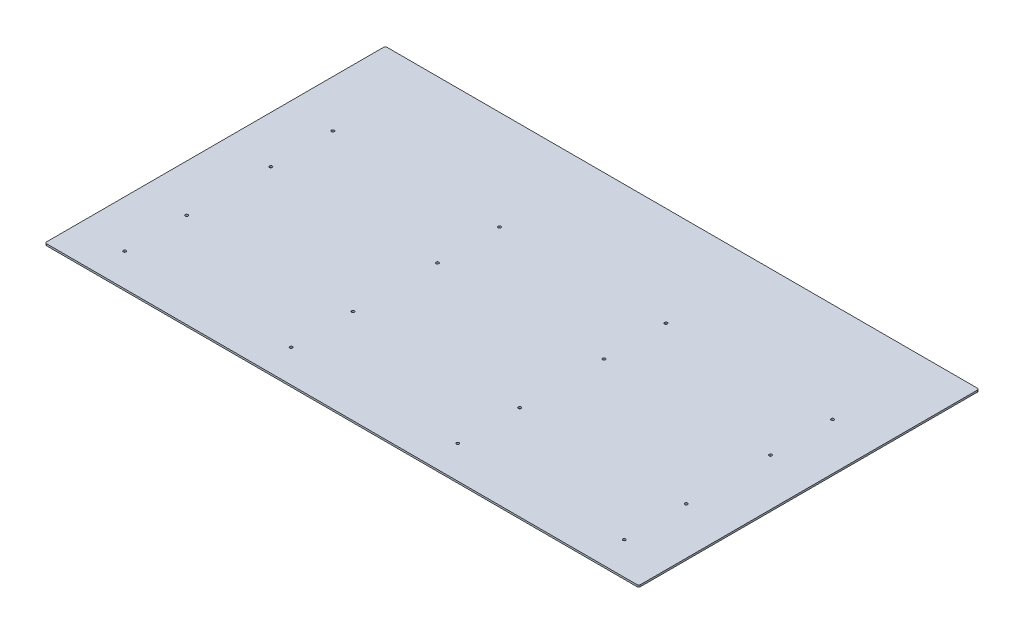
ISO-10303-21;
HEADER;
FILE_DESCRIPTION(('STEP AP214'),'2;1');
FILE_NAME('part.step','',(''),(''),'','','');
FILE_SCHEMA(('AUTOMOTIVE_DESIGN { 1 0 10303 214 1 1 1 1 }'));
ENDSEC;
DATA;
#1=APPLICATION_CONTEXT('core data for automotive mechanical design processes');
#2=APPLICATION_PROTOCOL_DEFINITION('international standard','automotive_design',2000,#1);
#3=PRODUCT_CONTEXT('',#1,'mechanical');
#4=PRODUCT('Part','Part','',(#3));
#5=PRODUCT_RELATED_PRODUCT_CATEGORY('part','',(#4));
#6=PRODUCT_DEFINITION_FORMATION('','',#4);
#7=PRODUCT_DEFINITION_CONTEXT('part definition',#1,'design');
#8=PRODUCT_DEFINITION('design','',#6,#7);
#9=PRODUCT_DEFINITION_SHAPE('','',#8);
#10=(LENGTH_UNIT() NAMED_UNIT(*) SI_UNIT(.MILLI.,.METRE.));
#11=(NAMED_UNIT(*) PLANE_ANGLE_UNIT() SI_UNIT($,.RADIAN.));
#12=(NAMED_UNIT(*) SI_UNIT($,.STERADIAN.) SOLID_ANGLE_UNIT());
#13=UNCERTAINTY_MEASURE_WITH_UNIT(LENGTH_MEASURE(1.E-05),#10,'distance_accuracy_value','');
#14=(GEOMETRIC_REPRESENTATION_CONTEXT(3) GLOBAL_UNCERTAINTY_ASSIGNED_CONTEXT((#13)) GLOBAL_UNIT_ASSIGNED_CONTEXT((#10,
#11,#12)) REPRESENTATION_CONTEXT('',''));
#15=CARTESIAN_POINT('',(0.,0.,0.));
#16=DIRECTION('',(0.,0.,1.));
#17=DIRECTION('',(1.,0.,0.));
#18=AXIS2_PLACEMENT_3D('',#15,#16,#17);
#19=CARTESIAN_POINT('',(517.525,3.175,-295.275));
#20=DIRECTION('',(0.,-1.,0.));
#21=DIRECTION('',(0.,0.,-1.));
#22=AXIS2_PLACEMENT_3D('',#19,#20,#21);
#23=CYLINDRICAL_SURFACE('',#22,3.17499999999998);
#24=CARTESIAN_POINT('',(517.525,0.,-295.275));
#25=DIRECTION('',(0.,1.,0.));
#26=DIRECTION('',(0.,0.,-1.));
#27=AXIS2_PLACEMENT_3D('',#24,#25,#26);
#28=CIRCLE('',#27,3.17499999999998);
#29=CARTESIAN_POINT('',(520.7,0.,-295.275));
#30=VERTEX_POINT('',#29);
#31=CARTESIAN_POINT('',(517.525,0.,-298.45));
#32=VERTEX_POINT('',#31);
#33=EDGE_CURVE('E133',#30,#32,#28,.T.);
#34=ORIENTED_EDGE('',*,*,#33,.T.);
#35=DIRECTION('',(0.,-1.,0.));
#36=VECTOR('',#35,1.);
#37=CARTESIAN_POINT('',(517.525,3.175,-298.45));
#38=LINE('',#37,#36);
#39=CARTESIAN_POINT('',(517.525,3.175,-298.45));
#40=VERTEX_POINT('',#39);
#41=EDGE_CURVE('E11',#40,#32,#38,.T.);
#42=ORIENTED_EDGE('',*,*,#41,.F.);
#43=CARTESIAN_POINT('',(517.525,3.175,-295.275));
#44=DIRECTION('',(0.,1.,0.));
#45=DIRECTION('',(0.,0.,-1.));
#46=AXIS2_PLACEMENT_3D('',#43,#44,#45);
#47=CIRCLE('',#46,3.17499999999998);
#48=CARTESIAN_POINT('',(520.7,3.175,-295.275));
#49=VERTEX_POINT('',#48);
#50=EDGE_CURVE('E148',#49,#40,#47,.T.);
#51=ORIENTED_EDGE('',*,*,#50,.F.);
#52=DIRECTION('',(0.,-1.,0.));
#53=VECTOR('',#52,1.);
#54=CARTESIAN_POINT('',(520.7,3.175,-295.275));
#55=LINE('',#54,#53);
#56=EDGE_CURVE('E129',#49,#30,#55,.T.);
#57=ORIENTED_EDGE('',*,*,#56,.T.);
#58=EDGE_LOOP('',(#34,#42,#51,#57));
#59=FACE_BOUND('',#58,.T.);
#60=ADVANCED_FACE('F37',(#59),#23,.T.);
#61=CARTESIAN_POINT('',(-517.525,3.175,-298.45));
#62=DIRECTION('',(0.,0.,1.));
#63=DIRECTION('',(1.,0.,0.));
#64=AXIS2_PLACEMENT_3D('',#61,#62,#63);
#65=PLANE('',#64);
#66=DIRECTION('',(-1.,0.,0.));
#67=VECTOR('',#66,1.);
#68=CARTESIAN_POINT('',(-517.525,0.,-298.45));
#69=LINE('',#68,#67);
#70=CARTESIAN_POINT('',(-517.525,0.,-298.45));
#71=VERTEX_POINT('',#70);
#72=EDGE_CURVE('E136',#32,#71,#69,.T.);
#73=ORIENTED_EDGE('',*,*,#72,.T.);
#74=DIRECTION('',(0.,-1.,0.));
#75=VECTOR('',#74,1.);
#76=CARTESIAN_POINT('',(-517.525,3.175,-298.45));
#77=LINE('',#76,#75);
#78=CARTESIAN_POINT('',(-517.525,3.175,-298.45));
#79=VERTEX_POINT('',#78);
#80=EDGE_CURVE('E45',#79,#71,#77,.T.);
#81=ORIENTED_EDGE('',*,*,#80,.F.);
#82=DIRECTION('',(-1.,0.,0.));
#83=VECTOR('',#82,1.);
#84=CARTESIAN_POINT('',(-517.525,3.175,-298.45));
#85=LINE('',#84,#83);
#86=EDGE_CURVE('E96',#40,#79,#85,.T.);
#87=ORIENTED_EDGE('',*,*,#86,.F.);
#88=ORIENTED_EDGE('',*,*,#41,.T.);
#89=EDGE_LOOP('',(#73,#81,#87,#88));
#90=FACE_BOUND('',#89,.T.);
#91=ADVANCED_FACE('F326',(#90),#65,.F.);
#92=CARTESIAN_POINT('',(-517.525,3.175,-295.275));
#93=DIRECTION('',(0.,-1.,0.));
#94=DIRECTION('',(0.,0.,-1.));
#95=AXIS2_PLACEMENT_3D('',#92,#93,#94);
#96=CYLINDRICAL_SURFACE('',#95,3.17499999999998);
#97=CARTESIAN_POINT('',(-517.525,0.,-295.275));
#98=DIRECTION('',(0.,1.,0.));
#99=DIRECTION('',(0.,0.,-1.));
#100=AXIS2_PLACEMENT_3D('',#97,#98,#99);
#101=CIRCLE('',#100,3.17499999999998);
#102=CARTESIAN_POINT('',(-520.7,0.,-295.275));
#103=VERTEX_POINT('',#102);
#104=EDGE_CURVE('E139',#71,#103,#101,.T.);
#105=ORIENTED_EDGE('',*,*,#104,.T.);
#106=DIRECTION('',(0.,-1.,0.));
#107=VECTOR('',#106,1.);
#108=CARTESIAN_POINT('',(-520.7,3.175,-295.275));
#109=LINE('',#108,#107);
#110=CARTESIAN_POINT('',(-520.7,3.175,-295.275));
#111=VERTEX_POINT('',#110);
#112=EDGE_CURVE('E155',#111,#103,#109,.T.);
#113=ORIENTED_EDGE('',*,*,#112,.F.);
#114=CARTESIAN_POINT('',(-517.525,3.175,-295.275));
#115=DIRECTION('',(0.,1.,0.));
#116=DIRECTION('',(0.,0.,-1.));
#117=AXIS2_PLACEMENT_3D('',#114,#115,#116);
#118=CIRCLE('',#117,3.17499999999998);
#119=EDGE_CURVE('E163',#79,#111,#118,.T.);
#120=ORIENTED_EDGE('',*,*,#119,.F.);
#121=ORIENTED_EDGE('',*,*,#80,.T.);
#122=EDGE_LOOP('',(#105,#113,#120,#121));
#123=FACE_BOUND('',#122,.T.);
#124=ADVANCED_FACE('F161',(#123),#96,.T.);
#125=CARTESIAN_POINT('',(-520.7,3.175,295.275));
#126=DIRECTION('',(1.,0.,0.));
#127=DIRECTION('',(0.,0.,-1.));
#128=AXIS2_PLACEMENT_3D('',#125,#126,#127);
#129=PLANE('',#128);
#130=DIRECTION('',(0.,0.,1.));
#131=VECTOR('',#130,1.);
#132=CARTESIAN_POINT('',(-520.7,0.,295.275));
#133=LINE('',#132,#131);
#134=CARTESIAN_POINT('',(-520.7,0.,295.275));
#135=VERTEX_POINT('',#134);
#136=EDGE_CURVE('E141',#103,#135,#133,.T.);
#137=ORIENTED_EDGE('',*,*,#136,.T.);
#138=DIRECTION('',(0.,-1.,0.));
#139=VECTOR('',#138,1.);
#140=CARTESIAN_POINT('',(-520.7,3.175,295.275));
#141=LINE('',#140,#139);
#142=CARTESIAN_POINT('',(-520.7,3.175,295.275));
#143=VERTEX_POINT('',#142);
#144=EDGE_CURVE('E152',#143,#135,#141,.T.);
#145=ORIENTED_EDGE('',*,*,#144,.F.);
#146=DIRECTION('',(0.,0.,1.));
#147=VECTOR('',#146,1.);
#148=CARTESIAN_POINT('',(-520.7,3.175,295.275));
#149=LINE('',#148,#147);
#150=EDGE_CURVE('E175',#111,#143,#149,.T.);
#151=ORIENTED_EDGE('',*,*,#150,.F.);
#152=ORIENTED_EDGE('',*,*,#112,.T.);
#153=EDGE_LOOP('',(#137,#145,#151,#152));
#154=FACE_BOUND('',#153,.T.);
#155=ADVANCED_FACE('F171',(#154),#129,.F.);
#156=CARTESIAN_POINT('',(-517.525,3.175,295.275));
#157=DIRECTION('',(0.,-1.,0.));
#158=DIRECTION('',(0.,0.,-1.));
#159=AXIS2_PLACEMENT_3D('',#156,#157,#158);
#160=CYLINDRICAL_SURFACE('',#159,3.17499999999998);
#161=CARTESIAN_POINT('',(-517.525,0.,295.275));
#162=DIRECTION('',(0.,1.,0.));
#163=DIRECTION('',(0.,0.,-1.));
#164=AXIS2_PLACEMENT_3D('',#161,#162,#163);
#165=CIRCLE('',#164,3.17499999999998);
#166=CARTESIAN_POINT('',(-517.525,0.,298.45));
#167=VERTEX_POINT('',#166);
#168=EDGE_CURVE('E143',#135,#167,#165,.T.);
#169=ORIENTED_EDGE('',*,*,#168,.T.);
#170=DIRECTION('',(0.,-1.,0.));
#171=VECTOR('',#170,1.);
#172=CARTESIAN_POINT('',(-517.525,3.175,298.45));
#173=LINE('',#172,#171);
#174=CARTESIAN_POINT('',(-517.525,3.175,298.45));
#175=VERTEX_POINT('',#174);
#176=EDGE_CURVE('E124',#175,#167,#173,.T.);
#177=ORIENTED_EDGE('',*,*,#176,.F.);
#178=CARTESIAN_POINT('',(-517.525,3.175,295.275));
#179=DIRECTION('',(0.,1.,0.));
#180=DIRECTION('',(0.,0.,-1.));
#181=AXIS2_PLACEMENT_3D('',#178,#179,#180);
#182=CIRCLE('',#181,3.17499999999998);
#183=EDGE_CURVE('E115',#143,#175,#182,.T.);
#184=ORIENTED_EDGE('',*,*,#183,.F.);
#185=ORIENTED_EDGE('',*,*,#144,.T.);
#186=EDGE_LOOP('',(#169,#177,#184,#185));
#187=FACE_BOUND('',#186,.T.);
#188=ADVANCED_FACE('F174',(#187),#160,.T.);
#189=CARTESIAN_POINT('',(-517.525,3.175,298.45));
#190=DIRECTION('',(0.,0.,-1.));
#191=DIRECTION('',(-1.,0.,0.));
#192=AXIS2_PLACEMENT_3D('',#189,#190,#191);
#193=PLANE('',#192);
#194=DIRECTION('',(1.,0.,0.));
#195=VECTOR('',#194,1.);
#196=CARTESIAN_POINT('',(-517.525,0.,298.45));
#197=LINE('',#196,#195);
#198=CARTESIAN_POINT('',(517.525,0.,298.45));
#199=VERTEX_POINT('',#198);
#200=EDGE_CURVE('E123',#167,#199,#197,.T.);
#201=ORIENTED_EDGE('',*,*,#200,.T.);
#202=DIRECTION('',(0.,-1.,0.));
#203=VECTOR('',#202,1.);
#204=CARTESIAN_POINT('',(517.525,3.175,298.45));
#205=LINE('',#204,#203);
#206=CARTESIAN_POINT('',(517.525,3.175,298.45));
#207=VERTEX_POINT('',#206);
#208=EDGE_CURVE('E120',#207,#199,#205,.T.);
#209=ORIENTED_EDGE('',*,*,#208,.F.);
#210=DIRECTION('',(1.,0.,0.));
#211=VECTOR('',#210,1.);
#212=CARTESIAN_POINT('',(-517.525,3.175,298.45));
#213=LINE('',#212,#211);
#214=EDGE_CURVE('E109',#175,#207,#213,.T.);
#215=ORIENTED_EDGE('',*,*,#214,.F.);
#216=ORIENTED_EDGE('',*,*,#176,.T.);
#217=EDGE_LOOP('',(#201,#209,#215,#216));
#218=FACE_BOUND('',#217,.T.);
#219=ADVANCED_FACE('F121',(#218),#193,.F.);
#220=CARTESIAN_POINT('',(517.525,3.175,295.275));
#221=DIRECTION('',(0.,-1.,0.));
#222=DIRECTION('',(0.,0.,-1.));
#223=AXIS2_PLACEMENT_3D('',#220,#221,#222);
#224=CYLINDRICAL_SURFACE('',#223,3.17499999999998);
#225=CARTESIAN_POINT('',(517.525,0.,295.275));
#226=DIRECTION('',(0.,1.,0.));
#227=DIRECTION('',(0.,0.,1.));
#228=AXIS2_PLACEMENT_3D('',#225,#226,#227);
#229=CIRCLE('',#228,3.17499999999998);
#230=CARTESIAN_POINT('',(520.7,0.,295.275));
#231=VERTEX_POINT('',#230);
#232=EDGE_CURVE('E82',#199,#231,#229,.T.);
#233=ORIENTED_EDGE('',*,*,#232,.T.);
#234=DIRECTION('',(0.,-1.,0.));
#235=VECTOR('',#234,1.);
#236=CARTESIAN_POINT('',(520.7,3.175,295.275));
#237=LINE('',#236,#235);
#238=CARTESIAN_POINT('',(520.7,3.175,295.275));
#239=VERTEX_POINT('',#238);
#240=EDGE_CURVE('E125',#239,#231,#237,.T.);
#241=ORIENTED_EDGE('',*,*,#240,.F.);
#242=CARTESIAN_POINT('',(517.525,3.175,295.275));
#243=DIRECTION('',(0.,1.,0.));
#244=DIRECTION('',(0.,0.,1.));
#245=AXIS2_PLACEMENT_3D('',#242,#243,#244);
#246=CIRCLE('',#245,3.17499999999998);
#247=EDGE_CURVE('E113',#207,#239,#246,.T.);
#248=ORIENTED_EDGE('',*,*,#247,.F.);
#249=ORIENTED_EDGE('',*,*,#208,.T.);
#250=EDGE_LOOP('',(#233,#241,#248,#249));
#251=FACE_BOUND('',#250,.T.);
#252=ADVANCED_FACE('F127',(#251),#224,.T.);
#253=CARTESIAN_POINT('',(520.7,3.175,295.275));
#254=DIRECTION('',(-1.,0.,0.));
#255=DIRECTION('',(0.,0.,1.));
#256=AXIS2_PLACEMENT_3D('',#253,#254,#255);
#257=PLANE('',#256);
#258=DIRECTION('',(0.,0.,-1.));
#259=VECTOR('',#258,1.);
#260=CARTESIAN_POINT('',(520.7,0.,295.275));
#261=LINE('',#260,#259);
#262=EDGE_CURVE('E88',#231,#30,#261,.T.);
#263=ORIENTED_EDGE('',*,*,#262,.T.);
#264=ORIENTED_EDGE('',*,*,#56,.F.);
#265=DIRECTION('',(0.,0.,-1.));
#266=VECTOR('',#265,1.);
#267=CARTESIAN_POINT('',(520.7,3.175,295.275));
#268=LINE('',#267,#266);
#269=EDGE_CURVE('E53',#239,#49,#268,.T.);
#270=ORIENTED_EDGE('',*,*,#269,.F.);
#271=ORIENTED_EDGE('',*,*,#240,.T.);
#272=EDGE_LOOP('',(#263,#264,#270,#271));
#273=FACE_BOUND('',#272,.T.);
#274=ADVANCED_FACE('F333',(#273),#257,.F.);
#275=CARTESIAN_POINT('',(517.525,3.175,-295.275));
#276=DIRECTION('',(0.,-1.,0.));
#277=DIRECTION('',(0.,0.,-1.));
#278=AXIS2_PLACEMENT_3D('',#275,#276,#277);
#279=PLANE('',#278);
#280=CARTESIAN_POINT('',(-438.15,3.175,241.245275246687));
#281=DIRECTION('',(0.,-1.,0.));
#282=DIRECTION('',(0.,0.,-1.));
#283=AXIS2_PLACEMENT_3D('',#280,#281,#282);
#284=CIRCLE('',#283,2.45744999999997);
#285=CARTESIAN_POINT('',(-438.15,3.175,238.787825246687));
#286=VERTEX_POINT('',#285);
#287=EDGE_CURVE('E270',#286,#286,#284,.T.);
#288=ORIENTED_EDGE('',*,*,#287,.T.);
#289=EDGE_LOOP('',(#288));
#290=FACE_BOUND('',#289,.T.);
#291=CARTESIAN_POINT('',(-438.15,3.175,132.533275246687));
#292=DIRECTION('',(0.,-1.,0.));
#293=DIRECTION('',(0.,0.,-1.));
#294=AXIS2_PLACEMENT_3D('',#291,#292,#293);
#295=CIRCLE('',#294,2.45744999999997);
#296=CARTESIAN_POINT('',(-438.15,3.175,130.075825246687));
#297=VERTEX_POINT('',#296);
#298=EDGE_CURVE('E264',#297,#297,#295,.T.);
#299=ORIENTED_EDGE('',*,*,#298,.T.);
#300=EDGE_LOOP('',(#299));
#301=FACE_BOUND('',#300,.T.);
#302=CARTESIAN_POINT('',(-146.05,3.175,241.245275246687));
#303=DIRECTION('',(0.,-1.,0.));
#304=DIRECTION('',(0.,0.,-1.));
#305=AXIS2_PLACEMENT_3D('',#302,#303,#304);
#306=CIRCLE('',#305,2.45745);
#307=CARTESIAN_POINT('',(-146.05,3.175,238.787825246687));
#308=VERTEX_POINT('',#307);
#309=EDGE_CURVE('E258',#308,#308,#306,.T.);
#310=ORIENTED_EDGE('',*,*,#309,.T.);
#311=EDGE_LOOP('',(#310));
#312=FACE_BOUND('',#311,.T.);
#313=CARTESIAN_POINT('',(-146.05,3.175,132.533275246687));
#314=DIRECTION('',(0.,-1.,0.));
#315=DIRECTION('',(0.,0.,-1.));
#316=AXIS2_PLACEMENT_3D('',#313,#314,#315);
#317=CIRCLE('',#316,2.45745);
#318=CARTESIAN_POINT('',(-146.05,3.175,130.075825246687));
#319=VERTEX_POINT('',#318);
#320=EDGE_CURVE('E252',#319,#319,#317,.T.);
#321=ORIENTED_EDGE('',*,*,#320,.T.);
#322=EDGE_LOOP('',(#321));
#323=FACE_BOUND('',#322,.T.);
#324=CARTESIAN_POINT('',(146.05,3.175,241.245275246687));
#325=DIRECTION('',(0.,-1.,0.));
#326=DIRECTION('',(0.,0.,-1.));
#327=AXIS2_PLACEMENT_3D('',#324,#325,#326);
#328=CIRCLE('',#327,2.45745);
#329=CARTESIAN_POINT('',(146.05,3.175,238.787825246687));
#330=VERTEX_POINT('',#329);
#331=EDGE_CURVE('E246',#330,#330,#328,.T.);
#332=ORIENTED_EDGE('',*,*,#331,.T.);
#333=EDGE_LOOP('',(#332));
#334=FACE_BOUND('',#333,.T.);
#335=CARTESIAN_POINT('',(146.05,3.175,132.533275246687));
#336=DIRECTION('',(0.,-1.,0.));
#337=DIRECTION('',(0.,0.,-1.));
#338=AXIS2_PLACEMENT_3D('',#335,#336,#337);
#339=CIRCLE('',#338,2.45745);
#340=CARTESIAN_POINT('',(146.05,3.175,130.075825246687));
#341=VERTEX_POINT('',#340);
#342=EDGE_CURVE('E240',#341,#341,#339,.T.);
#343=ORIENTED_EDGE('',*,*,#342,.T.);
#344=EDGE_LOOP('',(#343));
#345=FACE_BOUND('',#344,.T.);
#346=CARTESIAN_POINT('',(438.15,3.175,241.245275246687));
#347=DIRECTION('',(0.,-1.,0.));
#348=DIRECTION('',(0.,0.,-1.));
#349=AXIS2_PLACEMENT_3D('',#346,#347,#348);
#350=CIRCLE('',#349,2.45744999999997);
#351=CARTESIAN_POINT('',(438.15,3.175,238.787825246687));
#352=VERTEX_POINT('',#351);
#353=EDGE_CURVE('E234',#352,#352,#350,.T.);
#354=ORIENTED_EDGE('',*,*,#353,.T.);
#355=EDGE_LOOP('',(#354));
#356=FACE_BOUND('',#355,.T.);
#357=CARTESIAN_POINT('',(438.15,3.175,132.533275246687));
#358=DIRECTION('',(0.,-1.,0.));
#359=DIRECTION('',(0.,0.,-1.));
#360=AXIS2_PLACEMENT_3D('',#357,#358,#359);
#361=CIRCLE('',#360,2.45744999999997);
#362=CARTESIAN_POINT('',(438.15,3.175,130.075825246687));
#363=VERTEX_POINT('',#362);
#364=EDGE_CURVE('E228',#363,#363,#361,.T.);
#365=ORIENTED_EDGE('',*,*,#364,.T.);
#366=EDGE_LOOP('',(#365));
#367=FACE_BOUND('',#366,.T.);
#368=CARTESIAN_POINT('',(438.15,3.175,-15.2947247449714));
#369=DIRECTION('',(0.,-1.,0.));
#370=DIRECTION('',(0.,0.,-1.));
#371=AXIS2_PLACEMENT_3D('',#368,#369,#370);
#372=CIRCLE('',#371,2.45744999999997);
#373=CARTESIAN_POINT('',(438.15,3.175,-17.7521747449714));
#374=VERTEX_POINT('',#373);
#375=EDGE_CURVE('E222',#374,#374,#372,.T.);
#376=ORIENTED_EDGE('',*,*,#375,.T.);
#377=EDGE_LOOP('',(#376));
#378=FACE_BOUND('',#377,.T.);
#379=CARTESIAN_POINT('',(438.15,3.175,-124.006724744972));
#380=DIRECTION('',(0.,-1.,0.));
#381=DIRECTION('',(0.,0.,-1.));
#382=AXIS2_PLACEMENT_3D('',#379,#380,#381);
#383=CIRCLE('',#382,2.45744999999997);
#384=CARTESIAN_POINT('',(438.15,3.175,-126.464174744971));
#385=VERTEX_POINT('',#384);
#386=EDGE_CURVE('E216',#385,#385,#383,.T.);
#387=ORIENTED_EDGE('',*,*,#386,.T.);
#388=EDGE_LOOP('',(#387));
#389=FACE_BOUND('',#388,.T.);
#390=CARTESIAN_POINT('',(146.05,3.175,-15.2947247449714));
#391=DIRECTION('',(0.,-1.,0.));
#392=DIRECTION('',(0.,0.,-1.));
#393=AXIS2_PLACEMENT_3D('',#390,#391,#392);
#394=CIRCLE('',#393,2.45745);
#395=CARTESIAN_POINT('',(146.05,3.175,-17.7521747449714));
#396=VERTEX_POINT('',#395);
#397=EDGE_CURVE('E210',#396,#396,#394,.T.);
#398=ORIENTED_EDGE('',*,*,#397,.T.);
#399=EDGE_LOOP('',(#398));
#400=FACE_BOUND('',#399,.T.);
#401=CARTESIAN_POINT('',(146.05,3.175,-124.006724744972));
#402=DIRECTION('',(0.,-1.,0.));
#403=DIRECTION('',(0.,0.,-1.));
#404=AXIS2_PLACEMENT_3D('',#401,#402,#403);
#405=CIRCLE('',#404,2.45745);
#406=CARTESIAN_POINT('',(146.05,3.175,-126.464174744972));
#407=VERTEX_POINT('',#406);
#408=EDGE_CURVE('E204',#407,#407,#405,.T.);
#409=ORIENTED_EDGE('',*,*,#408,.T.);
#410=EDGE_LOOP('',(#409));
#411=FACE_BOUND('',#410,.T.);
#412=CARTESIAN_POINT('',(-146.05,3.175,-124.006724744972));
#413=DIRECTION('',(0.,-1.,0.));
#414=DIRECTION('',(0.,0.,-1.));
#415=AXIS2_PLACEMENT_3D('',#412,#413,#414);
#416=CIRCLE('',#415,2.45745);
#417=CARTESIAN_POINT('',(-146.05,3.175,-126.464174744972));
#418=VERTEX_POINT('',#417);
#419=EDGE_CURVE('E198',#418,#418,#416,.T.);
#420=ORIENTED_EDGE('',*,*,#419,.T.);
#421=EDGE_LOOP('',(#420));
#422=FACE_BOUND('',#421,.T.);
#423=CARTESIAN_POINT('',(-146.05,3.175,-15.2947247449714));
#424=DIRECTION('',(0.,-1.,0.));
#425=DIRECTION('',(0.,0.,-1.));
#426=AXIS2_PLACEMENT_3D('',#423,#424,#425);
#427=CIRCLE('',#426,2.45745);
#428=CARTESIAN_POINT('',(-146.05,3.175,-17.7521747449714));
#429=VERTEX_POINT('',#428);
#430=EDGE_CURVE('E192',#429,#429,#427,.T.);
#431=ORIENTED_EDGE('',*,*,#430,.T.);
#432=EDGE_LOOP('',(#431));
#433=FACE_BOUND('',#432,.T.);
#434=CARTESIAN_POINT('',(-438.15,3.175,-15.2947247449714));
#435=DIRECTION('',(0.,-1.,0.));
#436=DIRECTION('',(0.,0.,-1.));
#437=AXIS2_PLACEMENT_3D('',#434,#435,#436);
#438=CIRCLE('',#437,2.45744999999997);
#439=CARTESIAN_POINT('',(-438.15,3.175,-17.7521747449714));
#440=VERTEX_POINT('',#439);
#441=EDGE_CURVE('E186',#440,#440,#438,.T.);
#442=ORIENTED_EDGE('',*,*,#441,.T.);
#443=EDGE_LOOP('',(#442));
#444=FACE_BOUND('',#443,.T.);
#445=CARTESIAN_POINT('',(-438.15,3.175,-124.006724744972));
#446=DIRECTION('',(0.,-1.,0.));
#447=DIRECTION('',(0.,0.,-1.));
#448=AXIS2_PLACEMENT_3D('',#445,#446,#447);
#449=CIRCLE('',#448,2.45744999999997);
#450=CARTESIAN_POINT('',(-438.15,3.175,-126.464174744971));
#451=VERTEX_POINT('',#450);
#452=EDGE_CURVE('E137',#451,#451,#449,.T.);
#453=ORIENTED_EDGE('',*,*,#452,.T.);
#454=EDGE_LOOP('',(#453));
#455=FACE_BOUND('',#454,.T.);
#456=ORIENTED_EDGE('',*,*,#50,.T.);
#457=ORIENTED_EDGE('',*,*,#86,.T.);
#458=ORIENTED_EDGE('',*,*,#119,.T.);
#459=ORIENTED_EDGE('',*,*,#150,.T.);
#460=ORIENTED_EDGE('',*,*,#183,.T.);
#461=ORIENTED_EDGE('',*,*,#214,.T.);
#462=ORIENTED_EDGE('',*,*,#247,.T.);
#463=ORIENTED_EDGE('',*,*,#269,.T.);
#464=EDGE_LOOP('',(#456,#457,#458,#459,#460,#461,#462,#463));
#465=FACE_BOUND('',#464,.T.);
#466=ADVANCED_FACE('F111',(#290,#301,#312,#323,#334,#345,#356,#367,#378,#389,#400,#411,#422,
#433,#444,#455,#465),#279,.F.);
#467=CARTESIAN_POINT('',(517.525,0.,-295.275));
#468=DIRECTION('',(0.,-1.,0.));
#469=DIRECTION('',(0.,0.,-1.));
#470=AXIS2_PLACEMENT_3D('',#467,#468,#469);
#471=PLANE('',#470);
#472=CARTESIAN_POINT('',(-438.15,0.,241.245275246687));
#473=DIRECTION('',(0.,-1.,0.));
#474=DIRECTION('',(0.,0.,-1.));
#475=AXIS2_PLACEMENT_3D('',#472,#473,#474);
#476=CIRCLE('',#475,2.45744999999997);
#477=CARTESIAN_POINT('',(-438.15,0.,238.787825246687));
#478=VERTEX_POINT('',#477);
#479=EDGE_CURVE('E273',#478,#478,#476,.T.);
#480=ORIENTED_EDGE('',*,*,#479,.F.);
#481=EDGE_LOOP('',(#480));
#482=FACE_BOUND('',#481,.T.);
#483=CARTESIAN_POINT('',(-438.15,0.,132.533275246687));
#484=DIRECTION('',(0.,-1.,0.));
#485=DIRECTION('',(0.,0.,-1.));
#486=AXIS2_PLACEMENT_3D('',#483,#484,#485);
#487=CIRCLE('',#486,2.45744999999997);
#488=CARTESIAN_POINT('',(-438.15,0.,130.075825246687));
#489=VERTEX_POINT('',#488);
#490=EDGE_CURVE('E267',#489,#489,#487,.T.);
#491=ORIENTED_EDGE('',*,*,#490,.F.);
#492=EDGE_LOOP('',(#491));
#493=FACE_BOUND('',#492,.T.);
#494=CARTESIAN_POINT('',(-146.05,0.,241.245275246687));
#495=DIRECTION('',(0.,-1.,0.));
#496=DIRECTION('',(0.,0.,-1.));
#497=AXIS2_PLACEMENT_3D('',#494,#495,#496);
#498=CIRCLE('',#497,2.45745);
#499=CARTESIAN_POINT('',(-146.05,0.,238.787825246687));
#500=VERTEX_POINT('',#499);
#501=EDGE_CURVE('E261',#500,#500,#498,.T.);
#502=ORIENTED_EDGE('',*,*,#501,.F.);
#503=EDGE_LOOP('',(#502));
#504=FACE_BOUND('',#503,.T.);
#505=CARTESIAN_POINT('',(-146.05,0.,132.533275246687));
#506=DIRECTION('',(0.,-1.,0.));
#507=DIRECTION('',(0.,0.,-1.));
#508=AXIS2_PLACEMENT_3D('',#505,#506,#507);
#509=CIRCLE('',#508,2.45745);
#510=CARTESIAN_POINT('',(-146.05,0.,130.075825246687));
#511=VERTEX_POINT('',#510);
#512=EDGE_CURVE('E255',#511,#511,#509,.T.);
#513=ORIENTED_EDGE('',*,*,#512,.F.);
#514=EDGE_LOOP('',(#513));
#515=FACE_BOUND('',#514,.T.);
#516=CARTESIAN_POINT('',(146.05,0.,241.245275246687));
#517=DIRECTION('',(0.,-1.,0.));
#518=DIRECTION('',(0.,0.,-1.));
#519=AXIS2_PLACEMENT_3D('',#516,#517,#518);
#520=CIRCLE('',#519,2.45745);
#521=CARTESIAN_POINT('',(146.05,0.,238.787825246687));
#522=VERTEX_POINT('',#521);
#523=EDGE_CURVE('E249',#522,#522,#520,.T.);
#524=ORIENTED_EDGE('',*,*,#523,.F.);
#525=EDGE_LOOP('',(#524));
#526=FACE_BOUND('',#525,.T.);
#527=CARTESIAN_POINT('',(146.05,0.,132.533275246687));
#528=DIRECTION('',(0.,-1.,0.));
#529=DIRECTION('',(0.,0.,-1.));
#530=AXIS2_PLACEMENT_3D('',#527,#528,#529);
#531=CIRCLE('',#530,2.45745);
#532=CARTESIAN_POINT('',(146.05,0.,130.075825246687));
#533=VERTEX_POINT('',#532);
#534=EDGE_CURVE('E243',#533,#533,#531,.T.);
#535=ORIENTED_EDGE('',*,*,#534,.F.);
#536=EDGE_LOOP('',(#535));
#537=FACE_BOUND('',#536,.T.);
#538=CARTESIAN_POINT('',(438.15,0.,241.245275246687));
#539=DIRECTION('',(0.,-1.,0.));
#540=DIRECTION('',(0.,0.,-1.));
#541=AXIS2_PLACEMENT_3D('',#538,#539,#540);
#542=CIRCLE('',#541,2.45744999999997);
#543=CARTESIAN_POINT('',(438.15,0.,238.787825246687));
#544=VERTEX_POINT('',#543);
#545=EDGE_CURVE('E237',#544,#544,#542,.T.);
#546=ORIENTED_EDGE('',*,*,#545,.F.);
#547=EDGE_LOOP('',(#546));
#548=FACE_BOUND('',#547,.T.);
#549=CARTESIAN_POINT('',(438.15,0.,132.533275246687));
#550=DIRECTION('',(0.,-1.,0.));
#551=DIRECTION('',(0.,0.,-1.));
#552=AXIS2_PLACEMENT_3D('',#549,#550,#551);
#553=CIRCLE('',#552,2.45744999999997);
#554=CARTESIAN_POINT('',(438.15,0.,130.075825246687));
#555=VERTEX_POINT('',#554);
#556=EDGE_CURVE('E231',#555,#555,#553,.T.);
#557=ORIENTED_EDGE('',*,*,#556,.F.);
#558=EDGE_LOOP('',(#557));
#559=FACE_BOUND('',#558,.T.);
#560=CARTESIAN_POINT('',(438.15,0.,-15.2947247449714));
#561=DIRECTION('',(0.,-1.,0.));
#562=DIRECTION('',(0.,0.,-1.));
#563=AXIS2_PLACEMENT_3D('',#560,#561,#562);
#564=CIRCLE('',#563,2.45744999999997);
#565=CARTESIAN_POINT('',(438.15,0.,-17.7521747449714));
#566=VERTEX_POINT('',#565);
#567=EDGE_CURVE('E225',#566,#566,#564,.T.);
#568=ORIENTED_EDGE('',*,*,#567,.F.);
#569=EDGE_LOOP('',(#568));
#570=FACE_BOUND('',#569,.T.);
#571=CARTESIAN_POINT('',(438.15,0.,-124.006724744972));
#572=DIRECTION('',(0.,-1.,0.));
#573=DIRECTION('',(0.,0.,-1.));
#574=AXIS2_PLACEMENT_3D('',#571,#572,#573);
#575=CIRCLE('',#574,2.45744999999997);
#576=CARTESIAN_POINT('',(438.15,0.,-126.464174744971));
#577=VERTEX_POINT('',#576);
#578=EDGE_CURVE('E219',#577,#577,#575,.T.);
#579=ORIENTED_EDGE('',*,*,#578,.F.);
#580=EDGE_LOOP('',(#579));
#581=FACE_BOUND('',#580,.T.);
#582=CARTESIAN_POINT('',(146.05,0.,-15.2947247449714));
#583=DIRECTION('',(0.,-1.,0.));
#584=DIRECTION('',(0.,0.,-1.));
#585=AXIS2_PLACEMENT_3D('',#582,#583,#584);
#586=CIRCLE('',#585,2.45745);
#587=CARTESIAN_POINT('',(146.05,0.,-17.7521747449714));
#588=VERTEX_POINT('',#587);
#589=EDGE_CURVE('E213',#588,#588,#586,.T.);
#590=ORIENTED_EDGE('',*,*,#589,.F.);
#591=EDGE_LOOP('',(#590));
#592=FACE_BOUND('',#591,.T.);
#593=CARTESIAN_POINT('',(146.05,0.,-124.006724744972));
#594=DIRECTION('',(0.,-1.,0.));
#595=DIRECTION('',(0.,0.,-1.));
#596=AXIS2_PLACEMENT_3D('',#593,#594,#595);
#597=CIRCLE('',#596,2.45745);
#598=CARTESIAN_POINT('',(146.05,0.,-126.464174744972));
#599=VERTEX_POINT('',#598);
#600=EDGE_CURVE('E207',#599,#599,#597,.T.);
#601=ORIENTED_EDGE('',*,*,#600,.F.);
#602=EDGE_LOOP('',(#601));
#603=FACE_BOUND('',#602,.T.);
#604=CARTESIAN_POINT('',(-146.05,0.,-124.006724744972));
#605=DIRECTION('',(0.,-1.,0.));
#606=DIRECTION('',(0.,0.,-1.));
#607=AXIS2_PLACEMENT_3D('',#604,#605,#606);
#608=CIRCLE('',#607,2.45745);
#609=CARTESIAN_POINT('',(-146.05,0.,-126.464174744972));
#610=VERTEX_POINT('',#609);
#611=EDGE_CURVE('E201',#610,#610,#608,.T.);
#612=ORIENTED_EDGE('',*,*,#611,.F.);
#613=EDGE_LOOP('',(#612));
#614=FACE_BOUND('',#613,.T.);
#615=CARTESIAN_POINT('',(-146.05,0.,-15.2947247449714));
#616=DIRECTION('',(0.,-1.,0.));
#617=DIRECTION('',(0.,0.,-1.));
#618=AXIS2_PLACEMENT_3D('',#615,#616,#617);
#619=CIRCLE('',#618,2.45745);
#620=CARTESIAN_POINT('',(-146.05,0.,-17.7521747449714));
#621=VERTEX_POINT('',#620);
#622=EDGE_CURVE('E195',#621,#621,#619,.T.);
#623=ORIENTED_EDGE('',*,*,#622,.F.);
#624=EDGE_LOOP('',(#623));
#625=FACE_BOUND('',#624,.T.);
#626=CARTESIAN_POINT('',(-438.15,0.,-15.2947247449714));
#627=DIRECTION('',(0.,-1.,0.));
#628=DIRECTION('',(0.,0.,-1.));
#629=AXIS2_PLACEMENT_3D('',#626,#627,#628);
#630=CIRCLE('',#629,2.45744999999997);
#631=CARTESIAN_POINT('',(-438.15,0.,-17.7521747449714));
#632=VERTEX_POINT('',#631);
#633=EDGE_CURVE('E189',#632,#632,#630,.T.);
#634=ORIENTED_EDGE('',*,*,#633,.F.);
#635=EDGE_LOOP('',(#634));
#636=FACE_BOUND('',#635,.T.);
#637=CARTESIAN_POINT('',(-438.15,0.,-124.006724744972));
#638=DIRECTION('',(0.,-1.,0.));
#639=DIRECTION('',(0.,0.,-1.));
#640=AXIS2_PLACEMENT_3D('',#637,#638,#639);
#641=CIRCLE('',#640,2.45744999999997);
#642=CARTESIAN_POINT('',(-438.15,0.,-126.464174744971));
#643=VERTEX_POINT('',#642);
#644=EDGE_CURVE('E183',#643,#643,#641,.T.);
#645=ORIENTED_EDGE('',*,*,#644,.F.);
#646=EDGE_LOOP('',(#645));
#647=FACE_BOUND('',#646,.T.);
#648=ORIENTED_EDGE('',*,*,#33,.F.);
#649=ORIENTED_EDGE('',*,*,#262,.F.);
#650=ORIENTED_EDGE('',*,*,#232,.F.);
#651=ORIENTED_EDGE('',*,*,#200,.F.);
#652=ORIENTED_EDGE('',*,*,#168,.F.);
#653=ORIENTED_EDGE('',*,*,#136,.F.);
#654=ORIENTED_EDGE('',*,*,#104,.F.);
#655=ORIENTED_EDGE('',*,*,#72,.F.);
#656=EDGE_LOOP('',(#648,#649,#650,#651,#652,#653,#654,#655));
#657=FACE_BOUND('',#656,.T.);
#658=ADVANCED_FACE('F167',(#482,#493,#504,#515,#526,#537,#548,#559,#570,#581,#592,#603,#614,
#625,#636,#647,#657),#471,.T.);
#659=CARTESIAN_POINT('',(-438.15,0.,-124.006724744972));
#660=DIRECTION('',(0.,-1.,0.));
#661=DIRECTION('',(0.,0.,-1.));
#662=AXIS2_PLACEMENT_3D('',#659,#660,#661);
#663=CYLINDRICAL_SURFACE('',#662,2.45744999999997);
#664=ORIENTED_EDGE('',*,*,#452,.F.);
#665=EDGE_LOOP('',(#664));
#666=FACE_BOUND('',#665,.T.);
#667=ORIENTED_EDGE('',*,*,#644,.T.);
#668=EDGE_LOOP('',(#667));
#669=FACE_BOUND('',#668,.T.);
#670=ADVANCED_FACE('F281',(#666,#669),#663,.F.);
#671=CARTESIAN_POINT('',(-438.15,0.,-15.2947247449714));
#672=DIRECTION('',(0.,-1.,0.));
#673=DIRECTION('',(0.,0.,-1.));
#674=AXIS2_PLACEMENT_3D('',#671,#672,#673);
#675=CYLINDRICAL_SURFACE('',#674,2.45744999999997);
#676=ORIENTED_EDGE('',*,*,#441,.F.);
#677=EDGE_LOOP('',(#676));
#678=FACE_BOUND('',#677,.T.);
#679=ORIENTED_EDGE('',*,*,#633,.T.);
#680=EDGE_LOOP('',(#679));
#681=FACE_BOUND('',#680,.T.);
#682=ADVANCED_FACE('F314',(#678,#681),#675,.F.);
#683=CARTESIAN_POINT('',(-146.05,0.,-15.2947247449714));
#684=DIRECTION('',(0.,-1.,0.));
#685=DIRECTION('',(0.,0.,-1.));
#686=AXIS2_PLACEMENT_3D('',#683,#684,#685);
#687=CYLINDRICAL_SURFACE('',#686,2.45745);
#688=ORIENTED_EDGE('',*,*,#430,.F.);
#689=EDGE_LOOP('',(#688));
#690=FACE_BOUND('',#689,.T.);
#691=ORIENTED_EDGE('',*,*,#622,.T.);
#692=EDGE_LOOP('',(#691));
#693=FACE_BOUND('',#692,.T.);
#694=ADVANCED_FACE('F320',(#690,#693),#687,.F.);
#695=CARTESIAN_POINT('',(-146.05,0.,-124.006724744972));
#696=DIRECTION('',(0.,-1.,0.));
#697=DIRECTION('',(0.,0.,-1.));
#698=AXIS2_PLACEMENT_3D('',#695,#696,#697);
#699=CYLINDRICAL_SURFACE('',#698,2.45745);
#700=ORIENTED_EDGE('',*,*,#419,.F.);
#701=EDGE_LOOP('',(#700));
#702=FACE_BOUND('',#701,.T.);
#703=ORIENTED_EDGE('',*,*,#611,.T.);
#704=EDGE_LOOP('',(#703));
#705=FACE_BOUND('',#704,.T.);
#706=ADVANCED_FACE('F417',(#702,#705),#699,.F.);
#707=CARTESIAN_POINT('',(146.05,0.,-124.006724744972));
#708=DIRECTION('',(0.,-1.,0.));
#709=DIRECTION('',(0.,0.,-1.));
#710=AXIS2_PLACEMENT_3D('',#707,#708,#709);
#711=CYLINDRICAL_SURFACE('',#710,2.45745);
#712=ORIENTED_EDGE('',*,*,#408,.F.);
#713=EDGE_LOOP('',(#712));
#714=FACE_BOUND('',#713,.T.);
#715=ORIENTED_EDGE('',*,*,#600,.T.);
#716=EDGE_LOOP('',(#715));
#717=FACE_BOUND('',#716,.T.);
#718=ADVANCED_FACE('F428',(#714,#717),#711,.F.);
#719=CARTESIAN_POINT('',(146.05,0.,-15.2947247449714));
#720=DIRECTION('',(0.,-1.,0.));
#721=DIRECTION('',(0.,0.,-1.));
#722=AXIS2_PLACEMENT_3D('',#719,#720,#721);
#723=CYLINDRICAL_SURFACE('',#722,2.45745);
#724=ORIENTED_EDGE('',*,*,#397,.F.);
#725=EDGE_LOOP('',(#724));
#726=FACE_BOUND('',#725,.T.);
#727=ORIENTED_EDGE('',*,*,#589,.T.);
#728=EDGE_LOOP('',(#727));
#729=FACE_BOUND('',#728,.T.);
#730=ADVANCED_FACE('F440',(#726,#729),#723,.F.);
#731=CARTESIAN_POINT('',(438.15,0.,-124.006724744972));
#732=DIRECTION('',(0.,-1.,0.));
#733=DIRECTION('',(0.,0.,-1.));
#734=AXIS2_PLACEMENT_3D('',#731,#732,#733);
#735=CYLINDRICAL_SURFACE('',#734,2.45744999999997);
#736=ORIENTED_EDGE('',*,*,#386,.F.);
#737=EDGE_LOOP('',(#736));
#738=FACE_BOUND('',#737,.T.);
#739=ORIENTED_EDGE('',*,*,#578,.T.);
#740=EDGE_LOOP('',(#739));
#741=FACE_BOUND('',#740,.T.);
#742=ADVANCED_FACE('F451',(#738,#741),#735,.F.);
#743=CARTESIAN_POINT('',(438.15,0.,-15.2947247449714));
#744=DIRECTION('',(0.,-1.,0.));
#745=DIRECTION('',(0.,0.,-1.));
#746=AXIS2_PLACEMENT_3D('',#743,#744,#745);
#747=CYLINDRICAL_SURFACE('',#746,2.45744999999997);
#748=ORIENTED_EDGE('',*,*,#375,.F.);
#749=EDGE_LOOP('',(#748));
#750=FACE_BOUND('',#749,.T.);
#751=ORIENTED_EDGE('',*,*,#567,.T.);
#752=EDGE_LOOP('',(#751));
#753=FACE_BOUND('',#752,.T.);
#754=ADVANCED_FACE('F462',(#750,#753),#747,.F.);
#755=CARTESIAN_POINT('',(438.15,0.,132.533275246687));
#756=DIRECTION('',(0.,-1.,0.));
#757=DIRECTION('',(0.,0.,-1.));
#758=AXIS2_PLACEMENT_3D('',#755,#756,#757);
#759=CYLINDRICAL_SURFACE('',#758,2.45744999999997);
#760=ORIENTED_EDGE('',*,*,#364,.F.);
#761=EDGE_LOOP('',(#760));
#762=FACE_BOUND('',#761,.T.);
#763=ORIENTED_EDGE('',*,*,#556,.T.);
#764=EDGE_LOOP('',(#763));
#765=FACE_BOUND('',#764,.T.);
#766=ADVANCED_FACE('F473',(#762,#765),#759,.F.);
#767=CARTESIAN_POINT('',(438.15,0.,241.245275246687));
#768=DIRECTION('',(0.,-1.,0.));
#769=DIRECTION('',(0.,0.,-1.));
#770=AXIS2_PLACEMENT_3D('',#767,#768,#769);
#771=CYLINDRICAL_SURFACE('',#770,2.45744999999997);
#772=ORIENTED_EDGE('',*,*,#353,.F.);
#773=EDGE_LOOP('',(#772));
#774=FACE_BOUND('',#773,.T.);
#775=ORIENTED_EDGE('',*,*,#545,.T.);
#776=EDGE_LOOP('',(#775));
#777=FACE_BOUND('',#776,.T.);
#778=ADVANCED_FACE('F484',(#774,#777),#771,.F.);
#779=CARTESIAN_POINT('',(146.05,0.,132.533275246687));
#780=DIRECTION('',(0.,-1.,0.));
#781=DIRECTION('',(0.,0.,-1.));
#782=AXIS2_PLACEMENT_3D('',#779,#780,#781);
#783=CYLINDRICAL_SURFACE('',#782,2.45745);
#784=ORIENTED_EDGE('',*,*,#342,.F.);
#785=EDGE_LOOP('',(#784));
#786=FACE_BOUND('',#785,.T.);
#787=ORIENTED_EDGE('',*,*,#534,.T.);
#788=EDGE_LOOP('',(#787));
#789=FACE_BOUND('',#788,.T.);
#790=ADVANCED_FACE('F495',(#786,#789),#783,.F.);
#791=CARTESIAN_POINT('',(146.05,0.,241.245275246687));
#792=DIRECTION('',(0.,-1.,0.));
#793=DIRECTION('',(0.,0.,-1.));
#794=AXIS2_PLACEMENT_3D('',#791,#792,#793);
#795=CYLINDRICAL_SURFACE('',#794,2.45745);
#796=ORIENTED_EDGE('',*,*,#331,.F.);
#797=EDGE_LOOP('',(#796));
#798=FACE_BOUND('',#797,.T.);
#799=ORIENTED_EDGE('',*,*,#523,.T.);
#800=EDGE_LOOP('',(#799));
#801=FACE_BOUND('',#800,.T.);
#802=ADVANCED_FACE('F506',(#798,#801),#795,.F.);
#803=CARTESIAN_POINT('',(-146.05,0.,132.533275246687));
#804=DIRECTION('',(0.,-1.,0.));
#805=DIRECTION('',(0.,0.,-1.));
#806=AXIS2_PLACEMENT_3D('',#803,#804,#805);
#807=CYLINDRICAL_SURFACE('',#806,2.45745);
#808=ORIENTED_EDGE('',*,*,#320,.F.);
#809=EDGE_LOOP('',(#808));
#810=FACE_BOUND('',#809,.T.);
#811=ORIENTED_EDGE('',*,*,#512,.T.);
#812=EDGE_LOOP('',(#811));
#813=FACE_BOUND('',#812,.T.);
#814=ADVANCED_FACE('F517',(#810,#813),#807,.F.);
#815=CARTESIAN_POINT('',(-146.05,0.,241.245275246687));
#816=DIRECTION('',(0.,-1.,0.));
#817=DIRECTION('',(0.,0.,-1.));
#818=AXIS2_PLACEMENT_3D('',#815,#816,#817);
#819=CYLINDRICAL_SURFACE('',#818,2.45745);
#820=ORIENTED_EDGE('',*,*,#309,.F.);
#821=EDGE_LOOP('',(#820));
#822=FACE_BOUND('',#821,.T.);
#823=ORIENTED_EDGE('',*,*,#501,.T.);
#824=EDGE_LOOP('',(#823));
#825=FACE_BOUND('',#824,.T.);
#826=ADVANCED_FACE('F528',(#822,#825),#819,.F.);
#827=CARTESIAN_POINT('',(-438.15,0.,132.533275246687));
#828=DIRECTION('',(0.,-1.,0.));
#829=DIRECTION('',(0.,0.,-1.));
#830=AXIS2_PLACEMENT_3D('',#827,#828,#829);
#831=CYLINDRICAL_SURFACE('',#830,2.45744999999997);
#832=ORIENTED_EDGE('',*,*,#298,.F.);
#833=EDGE_LOOP('',(#832));
#834=FACE_BOUND('',#833,.T.);
#835=ORIENTED_EDGE('',*,*,#490,.T.);
#836=EDGE_LOOP('',(#835));
#837=FACE_BOUND('',#836,.T.);
#838=ADVANCED_FACE('F539',(#834,#837),#831,.F.);
#839=CARTESIAN_POINT('',(-438.15,0.,241.245275246687));
#840=DIRECTION('',(0.,-1.,0.));
#841=DIRECTION('',(0.,0.,-1.));
#842=AXIS2_PLACEMENT_3D('',#839,#840,#841);
#843=CYLINDRICAL_SURFACE('',#842,2.45744999999997);
#844=ORIENTED_EDGE('',*,*,#287,.F.);
#845=EDGE_LOOP('',(#844));
#846=FACE_BOUND('',#845,.T.);
#847=ORIENTED_EDGE('',*,*,#479,.T.);
#848=EDGE_LOOP('',(#847));
#849=FACE_BOUND('',#848,.T.);
#850=ADVANCED_FACE('F277',(#846,#849),#843,.F.);
#851=CLOSED_SHELL('',(#60,#91,#124,#155,#188,#219,#252,#274,#466,#658,#670,#682,#694,#706,#718,
#730,#742,#754,#766,#778,#790,#802,#814,#826,#838,#850));
#852=MANIFOLD_SOLID_BREP('B2',#851);
#853=ADVANCED_BREP_SHAPE_REPRESENTATION('',(#18,#852),#14);
#854=SHAPE_DEFINITION_REPRESENTATION(#9,#853);
ENDSEC;
END-ISO-10303-21;
